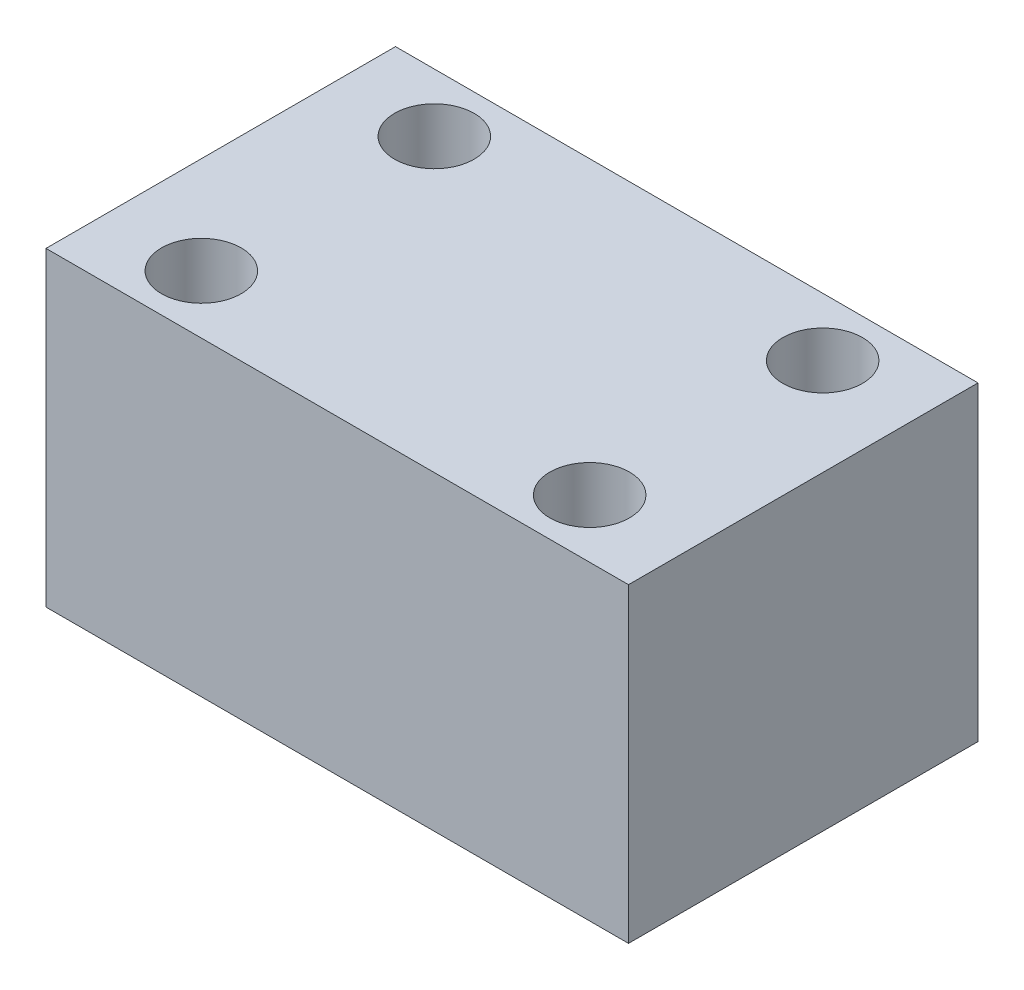
ISO-10303-21;
HEADER;
FILE_DESCRIPTION(('STEP AP214'),'2;1');
FILE_NAME('part.step','',(''),(''),'','','');
FILE_SCHEMA(('AUTOMOTIVE_DESIGN { 1 0 10303 214 1 1 1 1 }'));
ENDSEC;
DATA;
#1=APPLICATION_CONTEXT('core data for automotive mechanical design processes');
#2=APPLICATION_PROTOCOL_DEFINITION('international standard','automotive_design',2000,#1);
#3=PRODUCT_CONTEXT('',#1,'mechanical');
#4=PRODUCT('Part','Part','',(#3));
#5=PRODUCT_RELATED_PRODUCT_CATEGORY('part','',(#4));
#6=PRODUCT_DEFINITION_FORMATION('','',#4);
#7=PRODUCT_DEFINITION_CONTEXT('part definition',#1,'design');
#8=PRODUCT_DEFINITION('design','',#6,#7);
#9=PRODUCT_DEFINITION_SHAPE('','',#8);
#10=(LENGTH_UNIT() NAMED_UNIT(*) SI_UNIT(.MILLI.,.METRE.));
#11=(NAMED_UNIT(*) PLANE_ANGLE_UNIT() SI_UNIT($,.RADIAN.));
#12=(NAMED_UNIT(*) SI_UNIT($,.STERADIAN.) SOLID_ANGLE_UNIT());
#13=UNCERTAINTY_MEASURE_WITH_UNIT(LENGTH_MEASURE(1.E-05),#10,'distance_accuracy_value','');
#14=(GEOMETRIC_REPRESENTATION_CONTEXT(3) GLOBAL_UNCERTAINTY_ASSIGNED_CONTEXT((#13)) GLOBAL_UNIT_ASSIGNED_CONTEXT((#10,
#11,#12)) REPRESENTATION_CONTEXT('',''));
#15=CARTESIAN_POINT('',(0.,0.,0.));
#16=DIRECTION('',(0.,0.,1.));
#17=DIRECTION('',(1.,0.,0.));
#18=AXIS2_PLACEMENT_3D('',#15,#16,#17);
#19=CARTESIAN_POINT('',(0.,16.,-18.));
#20=DIRECTION('',(-1.,0.,0.));
#21=DIRECTION('',(0.,-1.,0.));
#22=AXIS2_PLACEMENT_3D('',#19,#20,#21);
#23=PLANE('',#22);
#24=DIRECTION('',(0.,-1.,0.));
#25=VECTOR('',#24,1.);
#26=CARTESIAN_POINT('',(0.,16.,0.));
#27=LINE('',#26,#25);
#28=CARTESIAN_POINT('',(0.,16.,0.));
#29=VERTEX_POINT('',#28);
#30=CARTESIAN_POINT('',(0.,0.,0.));
#31=VERTEX_POINT('',#30);
#32=EDGE_CURVE('E98',#29,#31,#27,.T.);
#33=ORIENTED_EDGE('',*,*,#32,.F.);
#34=DIRECTION('',(0.,0.,1.));
#35=VECTOR('',#34,1.);
#36=CARTESIAN_POINT('',(0.,16.,-18.));
#37=LINE('',#36,#35);
#38=CARTESIAN_POINT('',(0.,16.,-18.));
#39=VERTEX_POINT('',#38);
#40=EDGE_CURVE('E11',#39,#29,#37,.T.);
#41=ORIENTED_EDGE('',*,*,#40,.F.);
#42=DIRECTION('',(0.,-1.,0.));
#43=VECTOR('',#42,1.);
#44=CARTESIAN_POINT('',(0.,16.,-18.));
#45=LINE('',#44,#43);
#46=CARTESIAN_POINT('',(0.,0.,-18.));
#47=VERTEX_POINT('',#46);
#48=EDGE_CURVE('E91',#39,#47,#45,.T.);
#49=ORIENTED_EDGE('',*,*,#48,.T.);
#50=DIRECTION('',(0.,0.,1.));
#51=VECTOR('',#50,1.);
#52=CARTESIAN_POINT('',(0.,0.,-18.));
#53=LINE('',#52,#51);
#54=EDGE_CURVE('E36',#47,#31,#53,.T.);
#55=ORIENTED_EDGE('',*,*,#54,.T.);
#56=EDGE_LOOP('',(#33,#41,#49,#55));
#57=FACE_BOUND('',#56,.T.);
#58=ADVANCED_FACE('F33',(#57),#23,.T.);
#59=CARTESIAN_POINT('',(30.,16.,-18.));
#60=DIRECTION('',(0.,1.,0.));
#61=DIRECTION('',(-1.,0.,0.));
#62=AXIS2_PLACEMENT_3D('',#59,#60,#61);
#63=PLANE('',#62);
#64=CARTESIAN_POINT('',(25.,16.,-3.));
#65=DIRECTION('',(0.,1.,0.));
#66=DIRECTION('',(-1.,0.,0.));
#67=AXIS2_PLACEMENT_3D('',#64,#65,#66);
#68=CIRCLE('',#67,2.05);
#69=CARTESIAN_POINT('',(22.95,16.,-3.));
#70=VERTEX_POINT('',#69);
#71=EDGE_CURVE('E154',#70,#70,#68,.T.);
#72=ORIENTED_EDGE('',*,*,#71,.F.);
#73=EDGE_LOOP('',(#72));
#74=FACE_BOUND('',#73,.T.);
#75=CARTESIAN_POINT('',(5.,16.,-3.));
#76=DIRECTION('',(0.,1.,0.));
#77=DIRECTION('',(-1.,0.,0.));
#78=AXIS2_PLACEMENT_3D('',#75,#76,#77);
#79=CIRCLE('',#78,2.05);
#80=CARTESIAN_POINT('',(2.95,16.,-3.));
#81=VERTEX_POINT('',#80);
#82=EDGE_CURVE('E150',#81,#81,#79,.T.);
#83=ORIENTED_EDGE('',*,*,#82,.F.);
#84=EDGE_LOOP('',(#83));
#85=FACE_BOUND('',#84,.T.);
#86=CARTESIAN_POINT('',(5.,16.,-15.));
#87=DIRECTION('',(0.,1.,0.));
#88=DIRECTION('',(-1.,0.,0.));
#89=AXIS2_PLACEMENT_3D('',#86,#87,#88);
#90=CIRCLE('',#89,2.05);
#91=CARTESIAN_POINT('',(2.95,16.,-15.));
#92=VERTEX_POINT('',#91);
#93=EDGE_CURVE('E146',#92,#92,#90,.T.);
#94=ORIENTED_EDGE('',*,*,#93,.F.);
#95=EDGE_LOOP('',(#94));
#96=FACE_BOUND('',#95,.T.);
#97=CARTESIAN_POINT('',(25.,16.,-15.));
#98=DIRECTION('',(0.,1.,0.));
#99=DIRECTION('',(-1.,0.,0.));
#100=AXIS2_PLACEMENT_3D('',#97,#98,#99);
#101=CIRCLE('',#100,2.05);
#102=CARTESIAN_POINT('',(22.95,16.,-15.));
#103=VERTEX_POINT('',#102);
#104=EDGE_CURVE('E142',#103,#103,#101,.T.);
#105=ORIENTED_EDGE('',*,*,#104,.F.);
#106=EDGE_LOOP('',(#105));
#107=FACE_BOUND('',#106,.T.);
#108=DIRECTION('',(-1.,0.,0.));
#109=VECTOR('',#108,1.);
#110=CARTESIAN_POINT('',(30.,16.,0.));
#111=LINE('',#110,#109);
#112=CARTESIAN_POINT('',(30.,16.,0.));
#113=VERTEX_POINT('',#112);
#114=EDGE_CURVE('E93',#113,#29,#111,.T.);
#115=ORIENTED_EDGE('',*,*,#114,.F.);
#116=DIRECTION('',(0.,0.,1.));
#117=VECTOR('',#116,1.);
#118=CARTESIAN_POINT('',(30.,16.,-18.));
#119=LINE('',#118,#117);
#120=CARTESIAN_POINT('',(30.,16.,-18.));
#121=VERTEX_POINT('',#120);
#122=EDGE_CURVE('E42',#121,#113,#119,.T.);
#123=ORIENTED_EDGE('',*,*,#122,.F.);
#124=DIRECTION('',(-1.,0.,0.));
#125=VECTOR('',#124,1.);
#126=CARTESIAN_POINT('',(30.,16.,-18.));
#127=LINE('',#126,#125);
#128=EDGE_CURVE('E88',#121,#39,#127,.T.);
#129=ORIENTED_EDGE('',*,*,#128,.T.);
#130=ORIENTED_EDGE('',*,*,#40,.T.);
#131=EDGE_LOOP('',(#115,#123,#129,#130));
#132=FACE_BOUND('',#131,.T.);
#133=ADVANCED_FACE('F109',(#74,#85,#96,#107,#132),#63,.T.);
#134=CARTESIAN_POINT('',(30.,0.,-18.));
#135=DIRECTION('',(1.,0.,0.));
#136=DIRECTION('',(0.,0.,-1.));
#137=AXIS2_PLACEMENT_3D('',#134,#135,#136);
#138=PLANE('',#137);
#139=DIRECTION('',(0.,1.,0.));
#140=VECTOR('',#139,1.);
#141=CARTESIAN_POINT('',(30.,0.,0.));
#142=LINE('',#141,#140);
#143=CARTESIAN_POINT('',(30.,0.,0.));
#144=VERTEX_POINT('',#143);
#145=EDGE_CURVE('E83',#144,#113,#142,.T.);
#146=ORIENTED_EDGE('',*,*,#145,.F.);
#147=DIRECTION('',(0.,0.,1.));
#148=VECTOR('',#147,1.);
#149=CARTESIAN_POINT('',(30.,0.,-18.));
#150=LINE('',#149,#148);
#151=CARTESIAN_POINT('',(30.,0.,-18.));
#152=VERTEX_POINT('',#151);
#153=EDGE_CURVE('E78',#152,#144,#150,.T.);
#154=ORIENTED_EDGE('',*,*,#153,.F.);
#155=DIRECTION('',(0.,1.,0.));
#156=VECTOR('',#155,1.);
#157=CARTESIAN_POINT('',(30.,0.,-18.));
#158=LINE('',#157,#156);
#159=EDGE_CURVE('E81',#152,#121,#158,.T.);
#160=ORIENTED_EDGE('',*,*,#159,.T.);
#161=ORIENTED_EDGE('',*,*,#122,.T.);
#162=EDGE_LOOP('',(#146,#154,#160,#161));
#163=FACE_BOUND('',#162,.T.);
#164=ADVANCED_FACE('F80',(#163),#138,.T.);
#165=CARTESIAN_POINT('',(0.,0.,-18.));
#166=DIRECTION('',(0.,-1.,0.));
#167=DIRECTION('',(0.,0.,-1.));
#168=AXIS2_PLACEMENT_3D('',#165,#166,#167);
#169=PLANE('',#168);
#170=CARTESIAN_POINT('',(25.,0.,-3.));
#171=DIRECTION('',(0.,1.,0.));
#172=DIRECTION('',(-1.,0.,0.));
#173=AXIS2_PLACEMENT_3D('',#170,#171,#172);
#174=CIRCLE('',#173,2.05);
#175=CARTESIAN_POINT('',(22.95,0.,-3.));
#176=VERTEX_POINT('',#175);
#177=EDGE_CURVE('E130',#176,#176,#174,.T.);
#178=ORIENTED_EDGE('',*,*,#177,.T.);
#179=EDGE_LOOP('',(#178));
#180=FACE_BOUND('',#179,.T.);
#181=CARTESIAN_POINT('',(5.,0.,-3.));
#182=DIRECTION('',(0.,1.,0.));
#183=DIRECTION('',(-1.,0.,0.));
#184=AXIS2_PLACEMENT_3D('',#181,#182,#183);
#185=CIRCLE('',#184,2.05);
#186=CARTESIAN_POINT('',(2.95,0.,-3.));
#187=VERTEX_POINT('',#186);
#188=EDGE_CURVE('E134',#187,#187,#185,.T.);
#189=ORIENTED_EDGE('',*,*,#188,.T.);
#190=EDGE_LOOP('',(#189));
#191=FACE_BOUND('',#190,.T.);
#192=CARTESIAN_POINT('',(5.,0.,-15.));
#193=DIRECTION('',(0.,1.,0.));
#194=DIRECTION('',(-1.,0.,0.));
#195=AXIS2_PLACEMENT_3D('',#192,#193,#194);
#196=CIRCLE('',#195,2.05);
#197=CARTESIAN_POINT('',(2.95,0.,-15.));
#198=VERTEX_POINT('',#197);
#199=EDGE_CURVE('E138',#198,#198,#196,.T.);
#200=ORIENTED_EDGE('',*,*,#199,.T.);
#201=EDGE_LOOP('',(#200));
#202=FACE_BOUND('',#201,.T.);
#203=CARTESIAN_POINT('',(25.,0.,-15.));
#204=DIRECTION('',(0.,1.,0.));
#205=DIRECTION('',(-1.,0.,0.));
#206=AXIS2_PLACEMENT_3D('',#203,#204,#205);
#207=CIRCLE('',#206,2.05);
#208=CARTESIAN_POINT('',(22.95,0.,-15.));
#209=VERTEX_POINT('',#208);
#210=EDGE_CURVE('E102',#209,#209,#207,.T.);
#211=ORIENTED_EDGE('',*,*,#210,.T.);
#212=EDGE_LOOP('',(#211));
#213=FACE_BOUND('',#212,.T.);
#214=DIRECTION('',(1.,0.,0.));
#215=VECTOR('',#214,1.);
#216=CARTESIAN_POINT('',(0.,0.,0.));
#217=LINE('',#216,#215);
#218=EDGE_CURVE('E101',#31,#144,#217,.T.);
#219=ORIENTED_EDGE('',*,*,#218,.F.);
#220=ORIENTED_EDGE('',*,*,#54,.F.);
#221=DIRECTION('',(1.,0.,0.));
#222=VECTOR('',#221,1.);
#223=CARTESIAN_POINT('',(0.,0.,-18.));
#224=LINE('',#223,#222);
#225=EDGE_CURVE('E87',#47,#152,#224,.T.);
#226=ORIENTED_EDGE('',*,*,#225,.T.);
#227=ORIENTED_EDGE('',*,*,#153,.T.);
#228=EDGE_LOOP('',(#219,#220,#226,#227));
#229=FACE_BOUND('',#228,.T.);
#230=ADVANCED_FACE('F90',(#180,#191,#202,#213,#229),#169,.T.);
#231=CARTESIAN_POINT('',(0.,0.,-18.));
#232=DIRECTION('',(0.,0.,1.));
#233=DIRECTION('',(1.,0.,0.));
#234=AXIS2_PLACEMENT_3D('',#231,#232,#233);
#235=PLANE('',#234);
#236=ORIENTED_EDGE('',*,*,#48,.F.);
#237=ORIENTED_EDGE('',*,*,#128,.F.);
#238=ORIENTED_EDGE('',*,*,#159,.F.);
#239=ORIENTED_EDGE('',*,*,#225,.F.);
#240=EDGE_LOOP('',(#236,#237,#238,#239));
#241=FACE_BOUND('',#240,.T.);
#242=ADVANCED_FACE('F86',(#241),#235,.F.);
#243=CARTESIAN_POINT('',(0.,0.,0.));
#244=DIRECTION('',(0.,0.,1.));
#245=DIRECTION('',(1.,0.,0.));
#246=AXIS2_PLACEMENT_3D('',#243,#244,#245);
#247=PLANE('',#246);
#248=ORIENTED_EDGE('',*,*,#32,.T.);
#249=ORIENTED_EDGE('',*,*,#218,.T.);
#250=ORIENTED_EDGE('',*,*,#145,.T.);
#251=ORIENTED_EDGE('',*,*,#114,.T.);
#252=EDGE_LOOP('',(#248,#249,#250,#251));
#253=FACE_BOUND('',#252,.T.);
#254=ADVANCED_FACE('F108',(#253),#247,.T.);
#255=CARTESIAN_POINT('',(25.,0.,-15.));
#256=DIRECTION('',(0.,1.,0.));
#257=DIRECTION('',(-1.,0.,0.));
#258=AXIS2_PLACEMENT_3D('',#255,#256,#257);
#259=CYLINDRICAL_SURFACE('',#258,2.05);
#260=ORIENTED_EDGE('',*,*,#210,.F.);
#261=EDGE_LOOP('',(#260));
#262=FACE_BOUND('',#261,.T.);
#263=ORIENTED_EDGE('',*,*,#104,.T.);
#264=EDGE_LOOP('',(#263));
#265=FACE_BOUND('',#264,.T.);
#266=ADVANCED_FACE('F172',(#262,#265),#259,.F.);
#267=CARTESIAN_POINT('',(5.,0.,-15.));
#268=DIRECTION('',(0.,1.,0.));
#269=DIRECTION('',(-1.,0.,0.));
#270=AXIS2_PLACEMENT_3D('',#267,#268,#269);
#271=CYLINDRICAL_SURFACE('',#270,2.05);
#272=ORIENTED_EDGE('',*,*,#199,.F.);
#273=EDGE_LOOP('',(#272));
#274=FACE_BOUND('',#273,.T.);
#275=ORIENTED_EDGE('',*,*,#93,.T.);
#276=EDGE_LOOP('',(#275));
#277=FACE_BOUND('',#276,.T.);
#278=ADVANCED_FACE('F166',(#274,#277),#271,.F.);
#279=CARTESIAN_POINT('',(5.,0.,-3.));
#280=DIRECTION('',(0.,1.,0.));
#281=DIRECTION('',(-1.,0.,0.));
#282=AXIS2_PLACEMENT_3D('',#279,#280,#281);
#283=CYLINDRICAL_SURFACE('',#282,2.05);
#284=ORIENTED_EDGE('',*,*,#188,.F.);
#285=EDGE_LOOP('',(#284));
#286=FACE_BOUND('',#285,.T.);
#287=ORIENTED_EDGE('',*,*,#82,.T.);
#288=EDGE_LOOP('',(#287));
#289=FACE_BOUND('',#288,.T.);
#290=ADVANCED_FACE('F160',(#286,#289),#283,.F.);
#291=CARTESIAN_POINT('',(25.,0.,-3.));
#292=DIRECTION('',(0.,1.,0.));
#293=DIRECTION('',(-1.,0.,0.));
#294=AXIS2_PLACEMENT_3D('',#291,#292,#293);
#295=CYLINDRICAL_SURFACE('',#294,2.05);
#296=ORIENTED_EDGE('',*,*,#177,.F.);
#297=EDGE_LOOP('',(#296));
#298=FACE_BOUND('',#297,.T.);
#299=ORIENTED_EDGE('',*,*,#71,.T.);
#300=EDGE_LOOP('',(#299));
#301=FACE_BOUND('',#300,.T.);
#302=ADVANCED_FACE('F158',(#298,#301),#295,.F.);
#303=CLOSED_SHELL('',(#58,#133,#164,#230,#242,#254,#266,#278,#290,#302));
#304=MANIFOLD_SOLID_BREP('B2',#303);
#305=ADVANCED_BREP_SHAPE_REPRESENTATION('',(#18,#304),#14);
#306=SHAPE_DEFINITION_REPRESENTATION(#9,#305);
ENDSEC;
END-ISO-10303-21;
